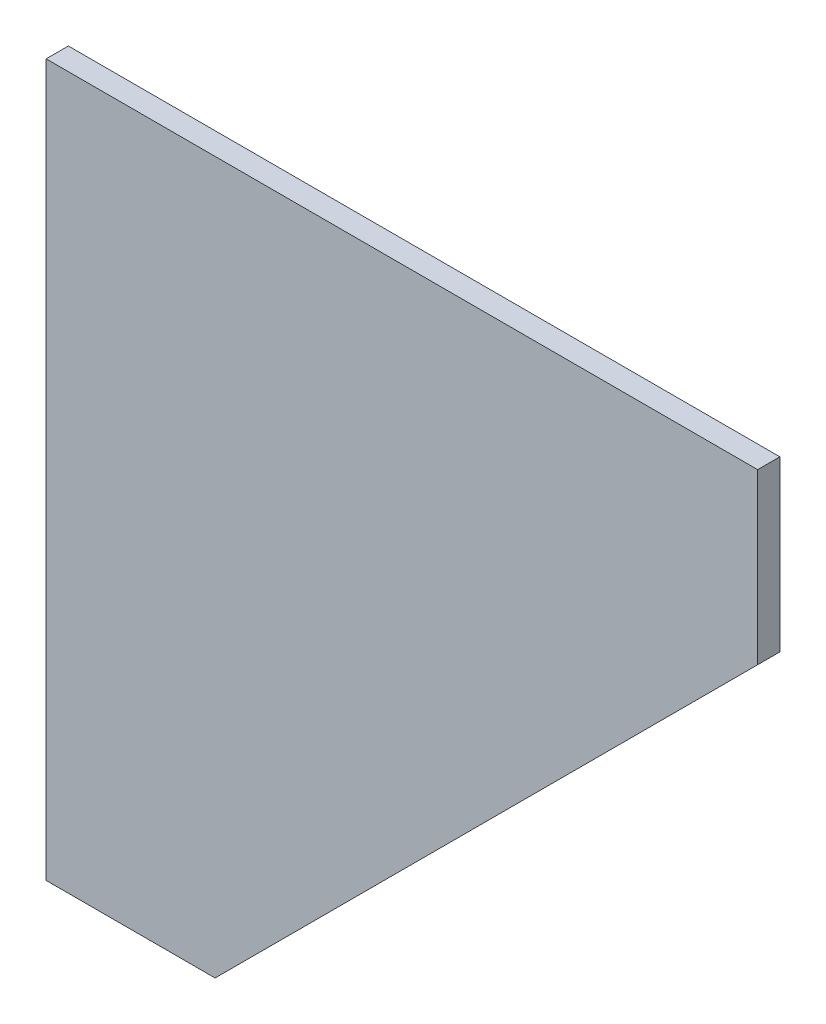
ISO-10303-21;
HEADER;
FILE_DESCRIPTION(('STEP AP214'),'2;1');
FILE_NAME('part.step','',(''),(''),'','','');
FILE_SCHEMA(('AUTOMOTIVE_DESIGN { 1 0 10303 214 1 1 1 1 }'));
ENDSEC;
DATA;
#1=APPLICATION_CONTEXT('core data for automotive mechanical design processes');
#2=APPLICATION_PROTOCOL_DEFINITION('international standard','automotive_design',2000,#1);
#3=PRODUCT_CONTEXT('',#1,'mechanical');
#4=PRODUCT('Part','Part','',(#3));
#5=PRODUCT_RELATED_PRODUCT_CATEGORY('part','',(#4));
#6=PRODUCT_DEFINITION_FORMATION('','',#4);
#7=PRODUCT_DEFINITION_CONTEXT('part definition',#1,'design');
#8=PRODUCT_DEFINITION('design','',#6,#7);
#9=PRODUCT_DEFINITION_SHAPE('','',#8);
#10=(LENGTH_UNIT() NAMED_UNIT(*) SI_UNIT(.MILLI.,.METRE.));
#11=(NAMED_UNIT(*) PLANE_ANGLE_UNIT() SI_UNIT($,.RADIAN.));
#12=(NAMED_UNIT(*) SI_UNIT($,.STERADIAN.) SOLID_ANGLE_UNIT());
#13=UNCERTAINTY_MEASURE_WITH_UNIT(LENGTH_MEASURE(1.E-05),#10,'distance_accuracy_value','');
#14=(GEOMETRIC_REPRESENTATION_CONTEXT(3) GLOBAL_UNCERTAINTY_ASSIGNED_CONTEXT((#13)) GLOBAL_UNIT_ASSIGNED_CONTEXT((#10,
#11,#12)) REPRESENTATION_CONTEXT('',''));
#15=CARTESIAN_POINT('',(0.,0.,0.));
#16=DIRECTION('',(0.,0.,1.));
#17=DIRECTION('',(1.,0.,0.));
#18=AXIS2_PLACEMENT_3D('',#15,#16,#17);
#19=CARTESIAN_POINT('',(24.13,0.,3.175));
#20=DIRECTION('',(0.,1.,0.));
#21=DIRECTION('',(-1.,0.,0.));
#22=AXIS2_PLACEMENT_3D('',#19,#20,#21);
#23=PLANE('',#22);
#24=DIRECTION('',(1.,0.,0.));
#25=VECTOR('',#24,1.);
#26=CARTESIAN_POINT('',(24.13,0.,0.));
#27=LINE('',#26,#25);
#28=CARTESIAN_POINT('',(0.,0.,0.));
#29=VERTEX_POINT('',#28);
#30=CARTESIAN_POINT('',(24.13,0.,0.));
#31=VERTEX_POINT('',#30);
#32=EDGE_CURVE('E106',#29,#31,#27,.T.);
#33=ORIENTED_EDGE('',*,*,#32,.T.);
#34=DIRECTION('',(0.,0.,-1.));
#35=VECTOR('',#34,1.);
#36=CARTESIAN_POINT('',(24.13,0.,3.175));
#37=LINE('',#36,#35);
#38=CARTESIAN_POINT('',(24.13,0.,3.175));
#39=VERTEX_POINT('',#38);
#40=EDGE_CURVE('E11',#39,#31,#37,.T.);
#41=ORIENTED_EDGE('',*,*,#40,.F.);
#42=DIRECTION('',(1.,0.,0.));
#43=VECTOR('',#42,1.);
#44=CARTESIAN_POINT('',(24.13,0.,3.175));
#45=LINE('',#44,#43);
#46=CARTESIAN_POINT('',(0.,0.,3.175));
#47=VERTEX_POINT('',#46);
#48=EDGE_CURVE('E114',#47,#39,#45,.T.);
#49=ORIENTED_EDGE('',*,*,#48,.F.);
#50=DIRECTION('',(0.,0.,-1.));
#51=VECTOR('',#50,1.);
#52=CARTESIAN_POINT('',(0.,0.,3.175));
#53=LINE('',#52,#51);
#54=EDGE_CURVE('E102',#47,#29,#53,.T.);
#55=ORIENTED_EDGE('',*,*,#54,.T.);
#56=EDGE_LOOP('',(#33,#41,#49,#55));
#57=FACE_BOUND('',#56,.T.);
#58=ADVANCED_FACE('F32',(#57),#23,.F.);
#59=CARTESIAN_POINT('',(24.13,0.,3.175));
#60=DIRECTION('',(-0.707106781186547,0.707106781186548,0.));
#61=DIRECTION('',(-0.707106781186548,-0.707106781186547,0.));
#62=AXIS2_PLACEMENT_3D('',#59,#60,#61);
#63=PLANE('',#62);
#64=DIRECTION('',(0.707106781186548,0.707106781186547,0.));
#65=VECTOR('',#64,1.);
#66=CARTESIAN_POINT('',(24.13,0.,0.));
#67=LINE('',#66,#65);
#68=CARTESIAN_POINT('',(101.6,77.47,0.));
#69=VERTEX_POINT('',#68);
#70=EDGE_CURVE('E109',#31,#69,#67,.T.);
#71=ORIENTED_EDGE('',*,*,#70,.T.);
#72=DIRECTION('',(0.,0.,-1.));
#73=VECTOR('',#72,1.);
#74=CARTESIAN_POINT('',(101.6,77.47,3.175));
#75=LINE('',#74,#73);
#76=CARTESIAN_POINT('',(101.6,77.47,3.175));
#77=VERTEX_POINT('',#76);
#78=EDGE_CURVE('E40',#77,#69,#75,.T.);
#79=ORIENTED_EDGE('',*,*,#78,.F.);
#80=DIRECTION('',(0.707106781186548,0.707106781186547,0.));
#81=VECTOR('',#80,1.);
#82=CARTESIAN_POINT('',(24.13,0.,3.175));
#83=LINE('',#82,#81);
#84=EDGE_CURVE('E82',#39,#77,#83,.T.);
#85=ORIENTED_EDGE('',*,*,#84,.F.);
#86=ORIENTED_EDGE('',*,*,#40,.T.);
#87=EDGE_LOOP('',(#71,#79,#85,#86));
#88=FACE_BOUND('',#87,.T.);
#89=ADVANCED_FACE('F133',(#88),#63,.F.);
#90=CARTESIAN_POINT('',(101.6,101.6,3.175));
#91=DIRECTION('',(-1.,0.,0.));
#92=DIRECTION('',(0.,-1.,0.));
#93=AXIS2_PLACEMENT_3D('',#90,#91,#92);
#94=PLANE('',#93);
#95=DIRECTION('',(0.,1.,0.));
#96=VECTOR('',#95,1.);
#97=CARTESIAN_POINT('',(101.6,101.6,0.));
#98=LINE('',#97,#96);
#99=CARTESIAN_POINT('',(101.6,101.6,0.));
#100=VERTEX_POINT('',#99);
#101=EDGE_CURVE('E97',#69,#100,#98,.T.);
#102=ORIENTED_EDGE('',*,*,#101,.T.);
#103=DIRECTION('',(0.,0.,-1.));
#104=VECTOR('',#103,1.);
#105=CARTESIAN_POINT('',(101.6,101.6,3.175));
#106=LINE('',#105,#104);
#107=CARTESIAN_POINT('',(101.6,101.6,3.175));
#108=VERTEX_POINT('',#107);
#109=EDGE_CURVE('E94',#108,#100,#106,.T.);
#110=ORIENTED_EDGE('',*,*,#109,.F.);
#111=DIRECTION('',(0.,1.,0.));
#112=VECTOR('',#111,1.);
#113=CARTESIAN_POINT('',(101.6,101.6,3.175));
#114=LINE('',#113,#112);
#115=EDGE_CURVE('E86',#77,#108,#114,.T.);
#116=ORIENTED_EDGE('',*,*,#115,.F.);
#117=ORIENTED_EDGE('',*,*,#78,.T.);
#118=EDGE_LOOP('',(#102,#110,#116,#117));
#119=FACE_BOUND('',#118,.T.);
#120=ADVANCED_FACE('F95',(#119),#94,.F.);
#121=CARTESIAN_POINT('',(0.,101.6,3.175));
#122=DIRECTION('',(0.,-1.,0.));
#123=DIRECTION('',(0.,0.,-1.));
#124=AXIS2_PLACEMENT_3D('',#121,#122,#123);
#125=PLANE('',#124);
#126=DIRECTION('',(-1.,0.,0.));
#127=VECTOR('',#126,1.);
#128=CARTESIAN_POINT('',(0.,101.6,0.));
#129=LINE('',#128,#127);
#130=CARTESIAN_POINT('',(0.,101.6,0.));
#131=VERTEX_POINT('',#130);
#132=EDGE_CURVE('E68',#100,#131,#129,.T.);
#133=ORIENTED_EDGE('',*,*,#132,.T.);
#134=DIRECTION('',(0.,0.,-1.));
#135=VECTOR('',#134,1.);
#136=CARTESIAN_POINT('',(0.,101.6,3.175));
#137=LINE('',#136,#135);
#138=CARTESIAN_POINT('',(0.,101.6,3.175));
#139=VERTEX_POINT('',#138);
#140=EDGE_CURVE('E98',#139,#131,#137,.T.);
#141=ORIENTED_EDGE('',*,*,#140,.F.);
#142=DIRECTION('',(-1.,0.,0.));
#143=VECTOR('',#142,1.);
#144=CARTESIAN_POINT('',(0.,101.6,3.175));
#145=LINE('',#144,#143);
#146=EDGE_CURVE('E90',#108,#139,#145,.T.);
#147=ORIENTED_EDGE('',*,*,#146,.F.);
#148=ORIENTED_EDGE('',*,*,#109,.T.);
#149=EDGE_LOOP('',(#133,#141,#147,#148));
#150=FACE_BOUND('',#149,.T.);
#151=ADVANCED_FACE('F100',(#150),#125,.F.);
#152=CARTESIAN_POINT('',(0.,0.,3.175));
#153=DIRECTION('',(1.,0.,0.));
#154=DIRECTION('',(0.,0.,-1.));
#155=AXIS2_PLACEMENT_3D('',#152,#153,#154);
#156=PLANE('',#155);
#157=DIRECTION('',(0.,-1.,0.));
#158=VECTOR('',#157,1.);
#159=CARTESIAN_POINT('',(0.,0.,0.));
#160=LINE('',#159,#158);
#161=EDGE_CURVE('E74',#131,#29,#160,.T.);
#162=ORIENTED_EDGE('',*,*,#161,.T.);
#163=ORIENTED_EDGE('',*,*,#54,.F.);
#164=DIRECTION('',(0.,-1.,0.));
#165=VECTOR('',#164,1.);
#166=CARTESIAN_POINT('',(0.,0.,3.175));
#167=LINE('',#166,#165);
#168=EDGE_CURVE('E48',#139,#47,#167,.T.);
#169=ORIENTED_EDGE('',*,*,#168,.F.);
#170=ORIENTED_EDGE('',*,*,#140,.T.);
#171=EDGE_LOOP('',(#162,#163,#169,#170));
#172=FACE_BOUND('',#171,.T.);
#173=ADVANCED_FACE('F122',(#172),#156,.F.);
#174=CARTESIAN_POINT('',(0.,0.,3.175));
#175=DIRECTION('',(0.,0.,-1.));
#176=DIRECTION('',(-1.,0.,0.));
#177=AXIS2_PLACEMENT_3D('',#174,#175,#176);
#178=PLANE('',#177);
#179=ORIENTED_EDGE('',*,*,#48,.T.);
#180=ORIENTED_EDGE('',*,*,#84,.T.);
#181=ORIENTED_EDGE('',*,*,#115,.T.);
#182=ORIENTED_EDGE('',*,*,#146,.T.);
#183=ORIENTED_EDGE('',*,*,#168,.T.);
#184=EDGE_LOOP('',(#179,#180,#181,#182,#183));
#185=FACE_BOUND('',#184,.T.);
#186=ADVANCED_FACE('F88',(#185),#178,.F.);
#187=CARTESIAN_POINT('',(0.,0.,0.));
#188=DIRECTION('',(0.,0.,-1.));
#189=DIRECTION('',(-1.,0.,0.));
#190=AXIS2_PLACEMENT_3D('',#187,#188,#189);
#191=PLANE('',#190);
#192=ORIENTED_EDGE('',*,*,#32,.F.);
#193=ORIENTED_EDGE('',*,*,#161,.F.);
#194=ORIENTED_EDGE('',*,*,#132,.F.);
#195=ORIENTED_EDGE('',*,*,#101,.F.);
#196=ORIENTED_EDGE('',*,*,#70,.F.);
#197=EDGE_LOOP('',(#192,#193,#194,#195,#196));
#198=FACE_BOUND('',#197,.T.);
#199=ADVANCED_FACE('F118',(#198),#191,.T.);
#200=CLOSED_SHELL('',(#58,#89,#120,#151,#173,#186,#199));
#201=MANIFOLD_SOLID_BREP('B2',#200);
#202=ADVANCED_BREP_SHAPE_REPRESENTATION('',(#18,#201),#14);
#203=SHAPE_DEFINITION_REPRESENTATION(#9,#202);
ENDSEC;
END-ISO-10303-21;
